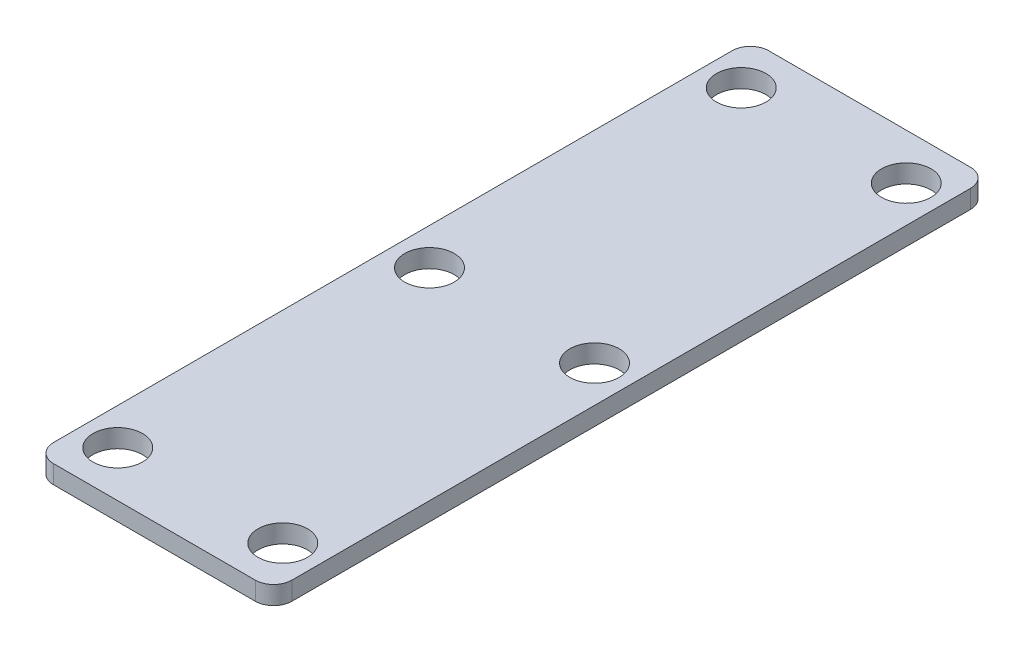
ISO-10303-21;
HEADER;
FILE_DESCRIPTION(('STEP AP214'),'2;1');
FILE_NAME('part.step','',(''),(''),'','','');
FILE_SCHEMA(('AUTOMOTIVE_DESIGN { 1 0 10303 214 1 1 1 1 }'));
ENDSEC;
DATA;
#1=APPLICATION_CONTEXT('core data for automotive mechanical design processes');
#2=APPLICATION_PROTOCOL_DEFINITION('international standard','automotive_design',2000,#1);
#3=PRODUCT_CONTEXT('',#1,'mechanical');
#4=PRODUCT('Part','Part','',(#3));
#5=PRODUCT_RELATED_PRODUCT_CATEGORY('part','',(#4));
#6=PRODUCT_DEFINITION_FORMATION('','',#4);
#7=PRODUCT_DEFINITION_CONTEXT('part definition',#1,'design');
#8=PRODUCT_DEFINITION('design','',#6,#7);
#9=PRODUCT_DEFINITION_SHAPE('','',#8);
#10=(LENGTH_UNIT() NAMED_UNIT(*) SI_UNIT(.MILLI.,.METRE.));
#11=(NAMED_UNIT(*) PLANE_ANGLE_UNIT() SI_UNIT($,.RADIAN.));
#12=(NAMED_UNIT(*) SI_UNIT($,.STERADIAN.) SOLID_ANGLE_UNIT());
#13=UNCERTAINTY_MEASURE_WITH_UNIT(LENGTH_MEASURE(1.E-05),#10,'distance_accuracy_value','');
#14=(GEOMETRIC_REPRESENTATION_CONTEXT(3) GLOBAL_UNCERTAINTY_ASSIGNED_CONTEXT((#13)) GLOBAL_UNIT_ASSIGNED_CONTEXT((#10,
#11,#12)) REPRESENTATION_CONTEXT('',''));
#15=CARTESIAN_POINT('',(0.,0.,0.));
#16=DIRECTION('',(0.,0.,1.));
#17=DIRECTION('',(1.,0.,0.));
#18=AXIS2_PLACEMENT_3D('',#15,#16,#17);
#19=CARTESIAN_POINT('',(6.5,1.,19.5));
#20=DIRECTION('',(-1.,0.,0.));
#21=DIRECTION('',(0.,0.,1.));
#22=AXIS2_PLACEMENT_3D('',#19,#20,#21);
#23=PLANE('',#22);
#24=DIRECTION('',(0.,0.,-1.));
#25=VECTOR('',#24,1.);
#26=CARTESIAN_POINT('',(6.5,1.,19.5));
#27=LINE('',#26,#25);
#28=CARTESIAN_POINT('',(6.5,1.,18.5));
#29=VERTEX_POINT('',#28);
#30=CARTESIAN_POINT('',(6.5,1.,-18.5));
#31=VERTEX_POINT('',#30);
#32=EDGE_CURVE('E124',#29,#31,#27,.T.);
#33=ORIENTED_EDGE('',*,*,#32,.F.);
#34=DIRECTION('',(0.,-1.,0.));
#35=VECTOR('',#34,1.);
#36=CARTESIAN_POINT('',(6.5,1.,18.5));
#37=LINE('',#36,#35);
#38=CARTESIAN_POINT('',(6.5,0.,18.5));
#39=VERTEX_POINT('',#38);
#40=EDGE_CURVE('E150',#29,#39,#37,.T.);
#41=ORIENTED_EDGE('',*,*,#40,.T.);
#42=DIRECTION('',(0.,0.,-1.));
#43=VECTOR('',#42,1.);
#44=CARTESIAN_POINT('',(6.5,0.,19.5));
#45=LINE('',#44,#43);
#46=CARTESIAN_POINT('',(6.5,0.,-18.5));
#47=VERTEX_POINT('',#46);
#48=EDGE_CURVE('E156',#39,#47,#45,.T.);
#49=ORIENTED_EDGE('',*,*,#48,.T.);
#50=DIRECTION('',(0.,-1.,0.));
#51=VECTOR('',#50,1.);
#52=CARTESIAN_POINT('',(6.5,1.,-18.5));
#53=LINE('',#52,#51);
#54=EDGE_CURVE('E148',#47,#31,#53,.F.);
#55=ORIENTED_EDGE('',*,*,#54,.T.);
#56=EDGE_LOOP('',(#33,#41,#49,#55));
#57=FACE_BOUND('',#56,.T.);
#58=ADVANCED_FACE('F32',(#57),#23,.F.);
#59=CARTESIAN_POINT('',(-6.5,1.,-19.5));
#60=DIRECTION('',(0.,0.,1.));
#61=DIRECTION('',(1.,0.,0.));
#62=AXIS2_PLACEMENT_3D('',#59,#60,#61);
#63=PLANE('',#62);
#64=DIRECTION('',(-1.,0.,0.));
#65=VECTOR('',#64,1.);
#66=CARTESIAN_POINT('',(-6.5,1.,-19.5));
#67=LINE('',#66,#65);
#68=CARTESIAN_POINT('',(5.49999999999999,1.,-19.5));
#69=VERTEX_POINT('',#68);
#70=CARTESIAN_POINT('',(-5.5,1.,-19.5));
#71=VERTEX_POINT('',#70);
#72=EDGE_CURVE('E127',#69,#71,#67,.T.);
#73=ORIENTED_EDGE('',*,*,#72,.F.);
#74=DIRECTION('',(0.,-1.,0.));
#75=VECTOR('',#74,1.);
#76=CARTESIAN_POINT('',(5.5,1.,-19.5));
#77=LINE('',#76,#75);
#78=CARTESIAN_POINT('',(5.49999999999999,0.,-19.5));
#79=VERTEX_POINT('',#78);
#80=EDGE_CURVE('E11',#69,#79,#77,.T.);
#81=ORIENTED_EDGE('',*,*,#80,.T.);
#82=DIRECTION('',(-1.,0.,0.));
#83=VECTOR('',#82,1.);
#84=CARTESIAN_POINT('',(-6.5,0.,-19.5));
#85=LINE('',#84,#83);
#86=CARTESIAN_POINT('',(-5.5,0.,-19.5));
#87=VERTEX_POINT('',#86);
#88=EDGE_CURVE('E129',#79,#87,#85,.T.);
#89=ORIENTED_EDGE('',*,*,#88,.T.);
#90=DIRECTION('',(0.,-1.,0.));
#91=VECTOR('',#90,1.);
#92=CARTESIAN_POINT('',(-5.5,1.,-19.5));
#93=LINE('',#92,#91);
#94=EDGE_CURVE('E40',#87,#71,#93,.F.);
#95=ORIENTED_EDGE('',*,*,#94,.T.);
#96=EDGE_LOOP('',(#73,#81,#89,#95));
#97=FACE_BOUND('',#96,.T.);
#98=ADVANCED_FACE('F233',(#97),#63,.F.);
#99=CARTESIAN_POINT('',(-6.5,1.,19.5));
#100=DIRECTION('',(1.,0.,0.));
#101=DIRECTION('',(0.,0.,-1.));
#102=AXIS2_PLACEMENT_3D('',#99,#100,#101);
#103=PLANE('',#102);
#104=DIRECTION('',(0.,0.,1.));
#105=VECTOR('',#104,1.);
#106=CARTESIAN_POINT('',(-6.5,0.,19.5));
#107=LINE('',#106,#105);
#108=CARTESIAN_POINT('',(-6.5,0.,-18.5));
#109=VERTEX_POINT('',#108);
#110=CARTESIAN_POINT('',(-6.5,0.,18.5));
#111=VERTEX_POINT('',#110);
#112=EDGE_CURVE('E125',#109,#111,#107,.T.);
#113=ORIENTED_EDGE('',*,*,#112,.T.);
#114=DIRECTION('',(0.,-1.,0.));
#115=VECTOR('',#114,1.);
#116=CARTESIAN_POINT('',(-6.5,1.,18.5));
#117=LINE('',#116,#115);
#118=CARTESIAN_POINT('',(-6.5,1.,18.5));
#119=VERTEX_POINT('',#118);
#120=EDGE_CURVE('E103',#111,#119,#117,.F.);
#121=ORIENTED_EDGE('',*,*,#120,.T.);
#122=DIRECTION('',(0.,0.,1.));
#123=VECTOR('',#122,1.);
#124=CARTESIAN_POINT('',(-6.5,1.,19.5));
#125=LINE('',#124,#123);
#126=CARTESIAN_POINT('',(-6.5,1.,-18.5));
#127=VERTEX_POINT('',#126);
#128=EDGE_CURVE('E168',#127,#119,#125,.T.);
#129=ORIENTED_EDGE('',*,*,#128,.F.);
#130=DIRECTION('',(0.,-1.,0.));
#131=VECTOR('',#130,1.);
#132=CARTESIAN_POINT('',(-6.5,1.,-18.5));
#133=LINE('',#132,#131);
#134=EDGE_CURVE('E108',#127,#109,#133,.T.);
#135=ORIENTED_EDGE('',*,*,#134,.T.);
#136=EDGE_LOOP('',(#113,#121,#129,#135));
#137=FACE_BOUND('',#136,.T.);
#138=ADVANCED_FACE('F231',(#137),#103,.F.);
#139=CARTESIAN_POINT('',(-6.5,1.,19.5));
#140=DIRECTION('',(0.,0.,-1.));
#141=DIRECTION('',(-1.,0.,0.));
#142=AXIS2_PLACEMENT_3D('',#139,#140,#141);
#143=PLANE('',#142);
#144=DIRECTION('',(1.,0.,0.));
#145=VECTOR('',#144,1.);
#146=CARTESIAN_POINT('',(-6.5,1.,19.5));
#147=LINE('',#146,#145);
#148=CARTESIAN_POINT('',(-5.5,1.,19.5));
#149=VERTEX_POINT('',#148);
#150=CARTESIAN_POINT('',(5.49999999999999,1.,19.5));
#151=VERTEX_POINT('',#150);
#152=EDGE_CURVE('E118',#149,#151,#147,.T.);
#153=ORIENTED_EDGE('',*,*,#152,.F.);
#154=DIRECTION('',(0.,-1.,0.));
#155=VECTOR('',#154,1.);
#156=CARTESIAN_POINT('',(-5.5,1.,19.5));
#157=LINE('',#156,#155);
#158=CARTESIAN_POINT('',(-5.5,0.,19.5));
#159=VERTEX_POINT('',#158);
#160=EDGE_CURVE('E102',#149,#159,#157,.T.);
#161=ORIENTED_EDGE('',*,*,#160,.T.);
#162=DIRECTION('',(1.,0.,0.));
#163=VECTOR('',#162,1.);
#164=CARTESIAN_POINT('',(-6.5,0.,19.5));
#165=LINE('',#164,#163);
#166=CARTESIAN_POINT('',(5.49999999999999,0.,19.5));
#167=VERTEX_POINT('',#166);
#168=EDGE_CURVE('E115',#159,#167,#165,.T.);
#169=ORIENTED_EDGE('',*,*,#168,.T.);
#170=DIRECTION('',(0.,-1.,0.));
#171=VECTOR('',#170,1.);
#172=CARTESIAN_POINT('',(5.5,1.,19.5));
#173=LINE('',#172,#171);
#174=EDGE_CURVE('E120',#167,#151,#173,.F.);
#175=ORIENTED_EDGE('',*,*,#174,.T.);
#176=EDGE_LOOP('',(#153,#161,#169,#175));
#177=FACE_BOUND('',#176,.T.);
#178=ADVANCED_FACE('F114',(#177),#143,.F.);
#179=CARTESIAN_POINT('',(0.,1.,0.));
#180=DIRECTION('',(0.,-1.,0.));
#181=DIRECTION('',(0.,0.,-1.));
#182=AXIS2_PLACEMENT_3D('',#179,#180,#181);
#183=PLANE('',#182);
#184=CARTESIAN_POINT('',(4.5,1.,17.));
#185=DIRECTION('',(0.,1.,0.));
#186=DIRECTION('',(0.,0.,1.));
#187=AXIS2_PLACEMENT_3D('',#184,#185,#186);
#188=CIRCLE('',#187,1.35);
#189=CARTESIAN_POINT('',(4.5,1.,18.35));
#190=VERTEX_POINT('',#189);
#191=EDGE_CURVE('E199',#190,#190,#188,.T.);
#192=ORIENTED_EDGE('',*,*,#191,.F.);
#193=EDGE_LOOP('',(#192));
#194=FACE_BOUND('',#193,.T.);
#195=CARTESIAN_POINT('',(-4.5,1.,17.));
#196=DIRECTION('',(0.,1.,0.));
#197=DIRECTION('',(0.,0.,1.));
#198=AXIS2_PLACEMENT_3D('',#195,#196,#197);
#199=CIRCLE('',#198,1.35);
#200=CARTESIAN_POINT('',(-4.5,1.,18.35));
#201=VERTEX_POINT('',#200);
#202=EDGE_CURVE('E193',#201,#201,#199,.T.);
#203=ORIENTED_EDGE('',*,*,#202,.F.);
#204=EDGE_LOOP('',(#203));
#205=FACE_BOUND('',#204,.T.);
#206=CARTESIAN_POINT('',(-4.50000000000001,1.,-17.));
#207=DIRECTION('',(0.,1.,0.));
#208=DIRECTION('',(0.,0.,1.));
#209=AXIS2_PLACEMENT_3D('',#206,#207,#208);
#210=CIRCLE('',#209,1.35);
#211=CARTESIAN_POINT('',(-4.50000000000001,1.,-15.65));
#212=VERTEX_POINT('',#211);
#213=EDGE_CURVE('E187',#212,#212,#210,.T.);
#214=ORIENTED_EDGE('',*,*,#213,.F.);
#215=EDGE_LOOP('',(#214));
#216=FACE_BOUND('',#215,.T.);
#217=CARTESIAN_POINT('',(4.5,1.,-17.));
#218=DIRECTION('',(0.,1.,0.));
#219=DIRECTION('',(0.,0.,1.));
#220=AXIS2_PLACEMENT_3D('',#217,#218,#219);
#221=CIRCLE('',#220,1.35);
#222=CARTESIAN_POINT('',(4.5,1.,-15.65));
#223=VERTEX_POINT('',#222);
#224=EDGE_CURVE('E181',#223,#223,#221,.T.);
#225=ORIENTED_EDGE('',*,*,#224,.F.);
#226=EDGE_LOOP('',(#225));
#227=FACE_BOUND('',#226,.T.);
#228=CARTESIAN_POINT('',(4.5,1.,0.));
#229=DIRECTION('',(0.,1.,0.));
#230=DIRECTION('',(0.,0.,1.));
#231=AXIS2_PLACEMENT_3D('',#228,#229,#230);
#232=CIRCLE('',#231,1.35);
#233=CARTESIAN_POINT('',(4.5,1.,1.35));
#234=VERTEX_POINT('',#233);
#235=EDGE_CURVE('E175',#234,#234,#232,.T.);
#236=ORIENTED_EDGE('',*,*,#235,.F.);
#237=EDGE_LOOP('',(#236));
#238=FACE_BOUND('',#237,.T.);
#239=CARTESIAN_POINT('',(-4.5,1.,0.));
#240=DIRECTION('',(0.,1.,0.));
#241=DIRECTION('',(0.,0.,1.));
#242=AXIS2_PLACEMENT_3D('',#239,#240,#241);
#243=CIRCLE('',#242,1.35);
#244=CARTESIAN_POINT('',(-4.5,1.,1.35));
#245=VERTEX_POINT('',#244);
#246=EDGE_CURVE('E164',#245,#245,#243,.T.);
#247=ORIENTED_EDGE('',*,*,#246,.F.);
#248=EDGE_LOOP('',(#247));
#249=FACE_BOUND('',#248,.T.);
#250=ORIENTED_EDGE('',*,*,#128,.T.);
#251=CARTESIAN_POINT('',(-5.5,1.,18.5));
#252=DIRECTION('',(0.,-1.,0.));
#253=DIRECTION('',(0.,0.,-1.));
#254=AXIS2_PLACEMENT_3D('',#251,#252,#253);
#255=CIRCLE('',#254,1.);
#256=EDGE_CURVE('E146',#119,#149,#255,.F.);
#257=ORIENTED_EDGE('',*,*,#256,.T.);
#258=ORIENTED_EDGE('',*,*,#152,.T.);
#259=CARTESIAN_POINT('',(5.5,1.,18.5));
#260=DIRECTION('',(0.,-1.,0.));
#261=DIRECTION('',(0.,0.,-1.));
#262=AXIS2_PLACEMENT_3D('',#259,#260,#261);
#263=CIRCLE('',#262,1.);
#264=EDGE_CURVE('E144',#151,#29,#263,.F.);
#265=ORIENTED_EDGE('',*,*,#264,.T.);
#266=ORIENTED_EDGE('',*,*,#32,.T.);
#267=CARTESIAN_POINT('',(5.5,1.,-18.5));
#268=DIRECTION('',(0.,-1.,0.));
#269=DIRECTION('',(0.,0.,-1.));
#270=AXIS2_PLACEMENT_3D('',#267,#268,#269);
#271=CIRCLE('',#270,1.);
#272=EDGE_CURVE('E53',#31,#69,#271,.F.);
#273=ORIENTED_EDGE('',*,*,#272,.T.);
#274=ORIENTED_EDGE('',*,*,#72,.T.);
#275=CARTESIAN_POINT('',(-5.5,1.,-18.5));
#276=DIRECTION('',(0.,-1.,0.));
#277=DIRECTION('',(0.,0.,-1.));
#278=AXIS2_PLACEMENT_3D('',#275,#276,#277);
#279=CIRCLE('',#278,1.);
#280=EDGE_CURVE('E141',#71,#127,#279,.F.);
#281=ORIENTED_EDGE('',*,*,#280,.T.);
#282=EDGE_LOOP('',(#250,#257,#258,#265,#266,#273,#274,#281));
#283=FACE_BOUND('',#282,.T.);
#284=ADVANCED_FACE('F214',(#194,#205,#216,#227,#238,#249,#283),#183,.F.);
#285=CARTESIAN_POINT('',(0.,0.,0.));
#286=DIRECTION('',(0.,-1.,0.));
#287=DIRECTION('',(0.,0.,-1.));
#288=AXIS2_PLACEMENT_3D('',#285,#286,#287);
#289=PLANE('',#288);
#290=CARTESIAN_POINT('',(4.5,0.,17.));
#291=DIRECTION('',(0.,1.,0.));
#292=DIRECTION('',(0.,0.,1.));
#293=AXIS2_PLACEMENT_3D('',#290,#291,#292);
#294=CIRCLE('',#293,1.35);
#295=CARTESIAN_POINT('',(4.5,0.,18.35));
#296=VERTEX_POINT('',#295);
#297=EDGE_CURVE('E196',#296,#296,#294,.T.);
#298=ORIENTED_EDGE('',*,*,#297,.T.);
#299=EDGE_LOOP('',(#298));
#300=FACE_BOUND('',#299,.T.);
#301=CARTESIAN_POINT('',(-4.5,0.,17.));
#302=DIRECTION('',(0.,1.,0.));
#303=DIRECTION('',(0.,0.,1.));
#304=AXIS2_PLACEMENT_3D('',#301,#302,#303);
#305=CIRCLE('',#304,1.35);
#306=CARTESIAN_POINT('',(-4.5,0.,18.35));
#307=VERTEX_POINT('',#306);
#308=EDGE_CURVE('E190',#307,#307,#305,.T.);
#309=ORIENTED_EDGE('',*,*,#308,.T.);
#310=EDGE_LOOP('',(#309));
#311=FACE_BOUND('',#310,.T.);
#312=CARTESIAN_POINT('',(-4.50000000000001,0.,-17.));
#313=DIRECTION('',(0.,1.,0.));
#314=DIRECTION('',(0.,0.,1.));
#315=AXIS2_PLACEMENT_3D('',#312,#313,#314);
#316=CIRCLE('',#315,1.35);
#317=CARTESIAN_POINT('',(-4.50000000000001,0.,-15.65));
#318=VERTEX_POINT('',#317);
#319=EDGE_CURVE('E184',#318,#318,#316,.T.);
#320=ORIENTED_EDGE('',*,*,#319,.T.);
#321=EDGE_LOOP('',(#320));
#322=FACE_BOUND('',#321,.T.);
#323=CARTESIAN_POINT('',(4.5,0.,-17.));
#324=DIRECTION('',(0.,1.,0.));
#325=DIRECTION('',(0.,0.,1.));
#326=AXIS2_PLACEMENT_3D('',#323,#324,#325);
#327=CIRCLE('',#326,1.35);
#328=CARTESIAN_POINT('',(4.5,0.,-15.65));
#329=VERTEX_POINT('',#328);
#330=EDGE_CURVE('E178',#329,#329,#327,.T.);
#331=ORIENTED_EDGE('',*,*,#330,.T.);
#332=EDGE_LOOP('',(#331));
#333=FACE_BOUND('',#332,.T.);
#334=CARTESIAN_POINT('',(4.5,0.,0.));
#335=DIRECTION('',(0.,1.,0.));
#336=DIRECTION('',(0.,0.,1.));
#337=AXIS2_PLACEMENT_3D('',#334,#335,#336);
#338=CIRCLE('',#337,1.35);
#339=CARTESIAN_POINT('',(4.5,0.,1.35));
#340=VERTEX_POINT('',#339);
#341=EDGE_CURVE('E173',#340,#340,#338,.T.);
#342=ORIENTED_EDGE('',*,*,#341,.T.);
#343=EDGE_LOOP('',(#342));
#344=FACE_BOUND('',#343,.T.);
#345=CARTESIAN_POINT('',(-4.5,0.,0.));
#346=DIRECTION('',(0.,1.,0.));
#347=DIRECTION('',(0.,0.,1.));
#348=AXIS2_PLACEMENT_3D('',#345,#346,#347);
#349=CIRCLE('',#348,1.35);
#350=CARTESIAN_POINT('',(-4.5,0.,1.35));
#351=VERTEX_POINT('',#350);
#352=EDGE_CURVE('E161',#351,#351,#349,.T.);
#353=ORIENTED_EDGE('',*,*,#352,.T.);
#354=EDGE_LOOP('',(#353));
#355=FACE_BOUND('',#354,.T.);
#356=ORIENTED_EDGE('',*,*,#168,.F.);
#357=CARTESIAN_POINT('',(-5.5,0.,18.5));
#358=DIRECTION('',(0.,-1.,0.));
#359=DIRECTION('',(0.,0.,-1.));
#360=AXIS2_PLACEMENT_3D('',#357,#358,#359);
#361=CIRCLE('',#360,1.);
#362=EDGE_CURVE('E98',#159,#111,#361,.T.);
#363=ORIENTED_EDGE('',*,*,#362,.T.);
#364=ORIENTED_EDGE('',*,*,#112,.F.);
#365=CARTESIAN_POINT('',(-5.5,0.,-18.5));
#366=DIRECTION('',(0.,-1.,0.));
#367=DIRECTION('',(0.,0.,-1.));
#368=AXIS2_PLACEMENT_3D('',#365,#366,#367);
#369=CIRCLE('',#368,1.);
#370=EDGE_CURVE('E119',#109,#87,#369,.T.);
#371=ORIENTED_EDGE('',*,*,#370,.T.);
#372=ORIENTED_EDGE('',*,*,#88,.F.);
#373=CARTESIAN_POINT('',(5.5,0.,-18.5));
#374=DIRECTION('',(0.,-1.,0.));
#375=DIRECTION('',(0.,0.,-1.));
#376=AXIS2_PLACEMENT_3D('',#373,#374,#375);
#377=CIRCLE('',#376,1.);
#378=EDGE_CURVE('E135',#79,#47,#377,.T.);
#379=ORIENTED_EDGE('',*,*,#378,.T.);
#380=ORIENTED_EDGE('',*,*,#48,.F.);
#381=CARTESIAN_POINT('',(5.5,0.,18.5));
#382=DIRECTION('',(0.,-1.,0.));
#383=DIRECTION('',(0.,0.,-1.));
#384=AXIS2_PLACEMENT_3D('',#381,#382,#383);
#385=CIRCLE('',#384,1.);
#386=EDGE_CURVE('E109',#39,#167,#385,.T.);
#387=ORIENTED_EDGE('',*,*,#386,.T.);
#388=EDGE_LOOP('',(#356,#363,#364,#371,#372,#379,#380,#387));
#389=FACE_BOUND('',#388,.T.);
#390=ADVANCED_FACE('F122',(#300,#311,#322,#333,#344,#355,#389),#289,.T.);
#391=CARTESIAN_POINT('',(-4.5,0.,0.));
#392=DIRECTION('',(0.,1.,0.));
#393=DIRECTION('',(0.,0.,1.));
#394=AXIS2_PLACEMENT_3D('',#391,#392,#393);
#395=CYLINDRICAL_SURFACE('',#394,1.35);
#396=ORIENTED_EDGE('',*,*,#352,.F.);
#397=EDGE_LOOP('',(#396));
#398=FACE_BOUND('',#397,.T.);
#399=ORIENTED_EDGE('',*,*,#246,.T.);
#400=EDGE_LOOP('',(#399));
#401=FACE_BOUND('',#400,.T.);
#402=ADVANCED_FACE('F257',(#398,#401),#395,.F.);
#403=CARTESIAN_POINT('',(4.5,0.,0.));
#404=DIRECTION('',(0.,1.,0.));
#405=DIRECTION('',(0.,0.,1.));
#406=AXIS2_PLACEMENT_3D('',#403,#404,#405);
#407=CYLINDRICAL_SURFACE('',#406,1.35);
#408=ORIENTED_EDGE('',*,*,#341,.F.);
#409=EDGE_LOOP('',(#408));
#410=FACE_BOUND('',#409,.T.);
#411=ORIENTED_EDGE('',*,*,#235,.T.);
#412=EDGE_LOOP('',(#411));
#413=FACE_BOUND('',#412,.T.);
#414=ADVANCED_FACE('F261',(#410,#413),#407,.F.);
#415=CARTESIAN_POINT('',(4.5,0.,-17.));
#416=DIRECTION('',(0.,1.,0.));
#417=DIRECTION('',(0.,0.,1.));
#418=AXIS2_PLACEMENT_3D('',#415,#416,#417);
#419=CYLINDRICAL_SURFACE('',#418,1.35);
#420=ORIENTED_EDGE('',*,*,#330,.F.);
#421=EDGE_LOOP('',(#420));
#422=FACE_BOUND('',#421,.T.);
#423=ORIENTED_EDGE('',*,*,#224,.T.);
#424=EDGE_LOOP('',(#423));
#425=FACE_BOUND('',#424,.T.);
#426=ADVANCED_FACE('F265',(#422,#425),#419,.F.);
#427=CARTESIAN_POINT('',(-4.50000000000001,0.,-17.));
#428=DIRECTION('',(0.,1.,0.));
#429=DIRECTION('',(0.,0.,1.));
#430=AXIS2_PLACEMENT_3D('',#427,#428,#429);
#431=CYLINDRICAL_SURFACE('',#430,1.35);
#432=ORIENTED_EDGE('',*,*,#319,.F.);
#433=EDGE_LOOP('',(#432));
#434=FACE_BOUND('',#433,.T.);
#435=ORIENTED_EDGE('',*,*,#213,.T.);
#436=EDGE_LOOP('',(#435));
#437=FACE_BOUND('',#436,.T.);
#438=ADVANCED_FACE('F269',(#434,#437),#431,.F.);
#439=CARTESIAN_POINT('',(-4.5,0.,17.));
#440=DIRECTION('',(0.,1.,0.));
#441=DIRECTION('',(0.,0.,1.));
#442=AXIS2_PLACEMENT_3D('',#439,#440,#441);
#443=CYLINDRICAL_SURFACE('',#442,1.35);
#444=ORIENTED_EDGE('',*,*,#308,.F.);
#445=EDGE_LOOP('',(#444));
#446=FACE_BOUND('',#445,.T.);
#447=ORIENTED_EDGE('',*,*,#202,.T.);
#448=EDGE_LOOP('',(#447));
#449=FACE_BOUND('',#448,.T.);
#450=ADVANCED_FACE('F210',(#446,#449),#443,.F.);
#451=CARTESIAN_POINT('',(4.5,0.,17.));
#452=DIRECTION('',(0.,1.,0.));
#453=DIRECTION('',(0.,0.,1.));
#454=AXIS2_PLACEMENT_3D('',#451,#452,#453);
#455=CYLINDRICAL_SURFACE('',#454,1.35);
#456=ORIENTED_EDGE('',*,*,#297,.F.);
#457=EDGE_LOOP('',(#456));
#458=FACE_BOUND('',#457,.T.);
#459=ORIENTED_EDGE('',*,*,#191,.T.);
#460=EDGE_LOOP('',(#459));
#461=FACE_BOUND('',#460,.T.);
#462=ADVANCED_FACE('F207',(#458,#461),#455,.F.);
#463=CARTESIAN_POINT('',(-5.5,1.,18.5));
#464=DIRECTION('',(0.,-1.,0.));
#465=DIRECTION('',(0.,0.,-1.));
#466=AXIS2_PLACEMENT_3D('',#463,#464,#465);
#467=CYLINDRICAL_SURFACE('',#466,1.);
#468=ORIENTED_EDGE('',*,*,#256,.F.);
#469=ORIENTED_EDGE('',*,*,#120,.F.);
#470=ORIENTED_EDGE('',*,*,#362,.F.);
#471=ORIENTED_EDGE('',*,*,#160,.F.);
#472=EDGE_LOOP('',(#468,#469,#470,#471));
#473=FACE_BOUND('',#472,.T.);
#474=ADVANCED_FACE('F101',(#473),#467,.T.);
#475=CARTESIAN_POINT('',(5.5,1.,18.5));
#476=DIRECTION('',(0.,-1.,0.));
#477=DIRECTION('',(0.,0.,-1.));
#478=AXIS2_PLACEMENT_3D('',#475,#476,#477);
#479=CYLINDRICAL_SURFACE('',#478,1.);
#480=ORIENTED_EDGE('',*,*,#264,.F.);
#481=ORIENTED_EDGE('',*,*,#174,.F.);
#482=ORIENTED_EDGE('',*,*,#386,.F.);
#483=ORIENTED_EDGE('',*,*,#40,.F.);
#484=EDGE_LOOP('',(#480,#481,#482,#483));
#485=FACE_BOUND('',#484,.T.);
#486=ADVANCED_FACE('F237',(#485),#479,.T.);
#487=CARTESIAN_POINT('',(5.5,1.,-18.5));
#488=DIRECTION('',(0.,-1.,0.));
#489=DIRECTION('',(0.,0.,-1.));
#490=AXIS2_PLACEMENT_3D('',#487,#488,#489);
#491=CYLINDRICAL_SURFACE('',#490,1.);
#492=ORIENTED_EDGE('',*,*,#272,.F.);
#493=ORIENTED_EDGE('',*,*,#54,.F.);
#494=ORIENTED_EDGE('',*,*,#378,.F.);
#495=ORIENTED_EDGE('',*,*,#80,.F.);
#496=EDGE_LOOP('',(#492,#493,#494,#495));
#497=FACE_BOUND('',#496,.T.);
#498=ADVANCED_FACE('F236',(#497),#491,.T.);
#499=CARTESIAN_POINT('',(-5.5,1.,-18.5));
#500=DIRECTION('',(0.,-1.,0.));
#501=DIRECTION('',(0.,0.,-1.));
#502=AXIS2_PLACEMENT_3D('',#499,#500,#501);
#503=CYLINDRICAL_SURFACE('',#502,1.);
#504=ORIENTED_EDGE('',*,*,#280,.F.);
#505=ORIENTED_EDGE('',*,*,#94,.F.);
#506=ORIENTED_EDGE('',*,*,#370,.F.);
#507=ORIENTED_EDGE('',*,*,#134,.F.);
#508=EDGE_LOOP('',(#504,#505,#506,#507));
#509=FACE_BOUND('',#508,.T.);
#510=ADVANCED_FACE('F34',(#509),#503,.T.);
#511=CLOSED_SHELL('',(#58,#98,#138,#178,#284,#390,#402,#414,#426,#438,#450,#462,#474,#486,#498,#510));
#512=MANIFOLD_SOLID_BREP('B2',#511);
#513=ADVANCED_BREP_SHAPE_REPRESENTATION('',(#18,#512),#14);
#514=SHAPE_DEFINITION_REPRESENTATION(#9,#513);
ENDSEC;
END-ISO-10303-21;
